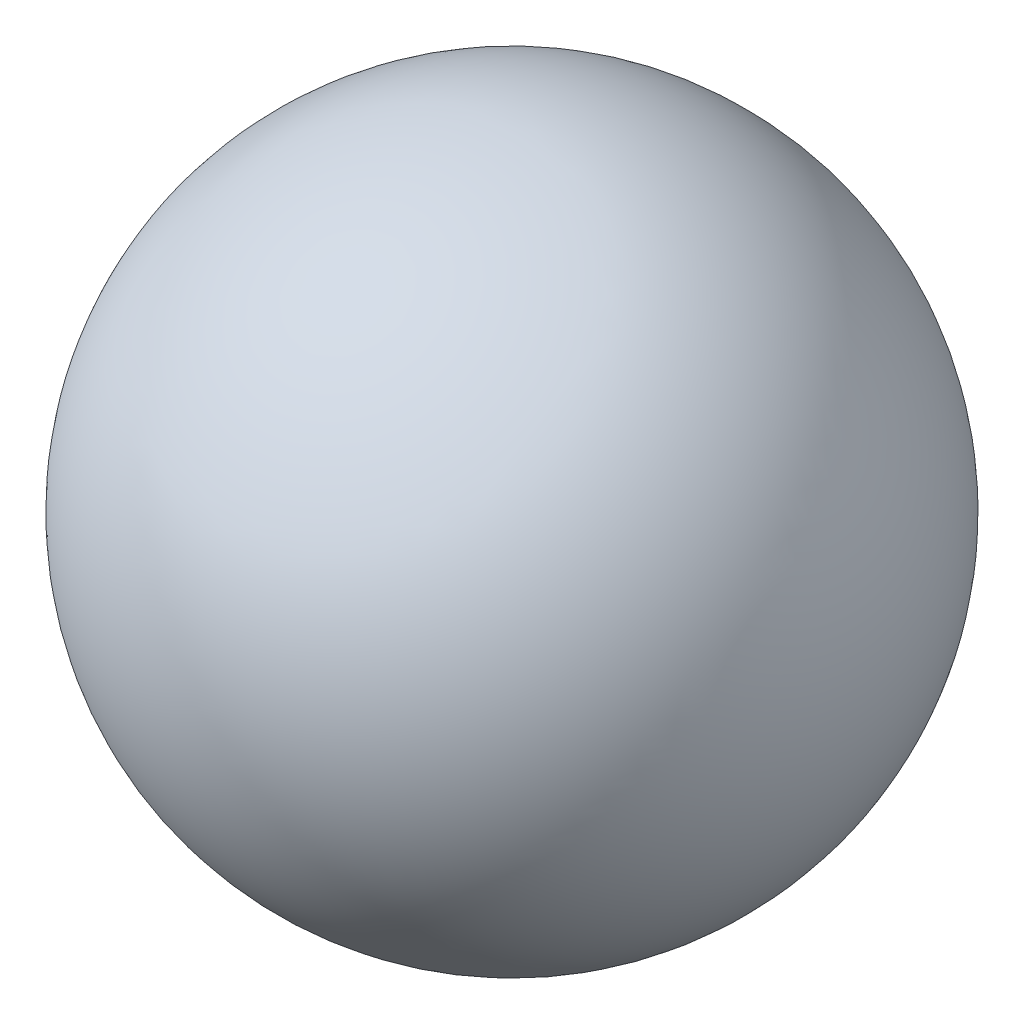
ISO-10303-21;
HEADER;
FILE_DESCRIPTION(('STEP AP214'),'2;1');
FILE_NAME('part.step','',(''),(''),'','','');
FILE_SCHEMA(('AUTOMOTIVE_DESIGN { 1 0 10303 214 1 1 1 1 }'));
ENDSEC;
DATA;
#1=APPLICATION_CONTEXT('core data for automotive mechanical design processes');
#2=APPLICATION_PROTOCOL_DEFINITION('international standard','automotive_design',2000,#1);
#3=PRODUCT_CONTEXT('',#1,'mechanical');
#4=PRODUCT('Part','Part','',(#3));
#5=PRODUCT_RELATED_PRODUCT_CATEGORY('part','',(#4));
#6=PRODUCT_DEFINITION_FORMATION('','',#4);
#7=PRODUCT_DEFINITION_CONTEXT('part definition',#1,'design');
#8=PRODUCT_DEFINITION('design','',#6,#7);
#9=PRODUCT_DEFINITION_SHAPE('','',#8);
#10=(LENGTH_UNIT() NAMED_UNIT(*) SI_UNIT(.MILLI.,.METRE.));
#11=(NAMED_UNIT(*) PLANE_ANGLE_UNIT() SI_UNIT($,.RADIAN.));
#12=(NAMED_UNIT(*) SI_UNIT($,.STERADIAN.) SOLID_ANGLE_UNIT());
#13=UNCERTAINTY_MEASURE_WITH_UNIT(LENGTH_MEASURE(1.E-05),#10,'distance_accuracy_value','');
#14=(GEOMETRIC_REPRESENTATION_CONTEXT(3) GLOBAL_UNCERTAINTY_ASSIGNED_CONTEXT((#13)) GLOBAL_UNIT_ASSIGNED_CONTEXT((#10,
#11,#12)) REPRESENTATION_CONTEXT('',''));
#15=CARTESIAN_POINT('',(0.,0.,0.));
#16=DIRECTION('',(0.,0.,1.));
#17=DIRECTION('',(1.,0.,0.));
#18=AXIS2_PLACEMENT_3D('',#15,#16,#17);
#19=CARTESIAN_POINT('',(8.,19.5,0.));
#20=DIRECTION('',(-1.,0.,0.));
#21=DIRECTION('',(0.,1.,0.));
#22=AXIS2_PLACEMENT_3D('',#19,#20,#21);
#23=SPHERICAL_SURFACE('',#22,5.1595);
#24=CARTESIAN_POINT('',(2.8405,19.5,0.));
#25=VERTEX_POINT('',#24);
#26=VERTEX_LOOP('',#25);
#27=FACE_BOUND('',#26,.T.);
#28=ADVANCED_FACE('F33',(#27),#23,.T.);
#29=CLOSED_SHELL('',(#28));
#30=MANIFOLD_SOLID_BREP('B2',#29);
#31=ADVANCED_BREP_SHAPE_REPRESENTATION('',(#18,#30),#14);
#32=SHAPE_DEFINITION_REPRESENTATION(#9,#31);
ENDSEC;
END-ISO-10303-21;
